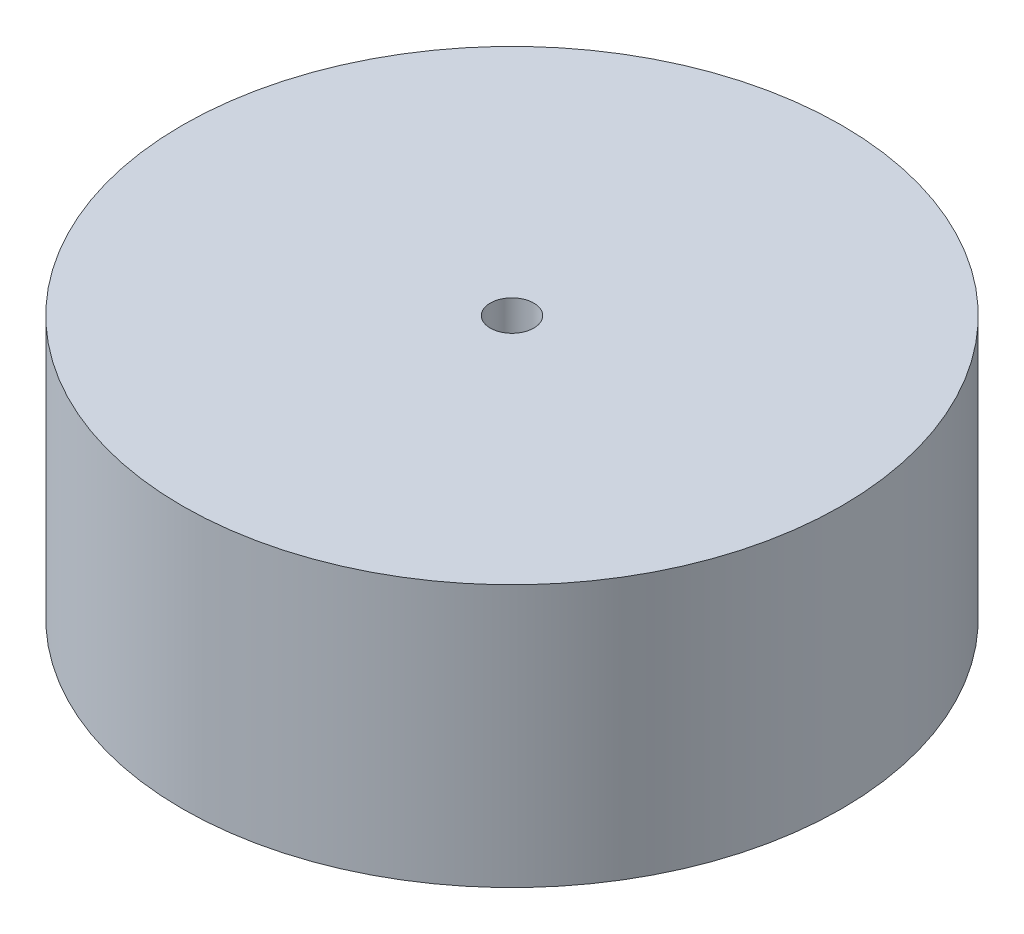
ISO-10303-21;
HEADER;
FILE_DESCRIPTION(('STEP AP214'),'2;1');
FILE_NAME('part.step','',(''),(''),'','','');
FILE_SCHEMA(('AUTOMOTIVE_DESIGN { 1 0 10303 214 1 1 1 1 }'));
ENDSEC;
DATA;
#1=APPLICATION_CONTEXT('core data for automotive mechanical design processes');
#2=APPLICATION_PROTOCOL_DEFINITION('international standard','automotive_design',2000,#1);
#3=PRODUCT_CONTEXT('',#1,'mechanical');
#4=PRODUCT('Part','Part','',(#3));
#5=PRODUCT_RELATED_PRODUCT_CATEGORY('part','',(#4));
#6=PRODUCT_DEFINITION_FORMATION('','',#4);
#7=PRODUCT_DEFINITION_CONTEXT('part definition',#1,'design');
#8=PRODUCT_DEFINITION('design','',#6,#7);
#9=PRODUCT_DEFINITION_SHAPE('','',#8);
#10=(LENGTH_UNIT() NAMED_UNIT(*) SI_UNIT(.MILLI.,.METRE.));
#11=(NAMED_UNIT(*) PLANE_ANGLE_UNIT() SI_UNIT($,.RADIAN.));
#12=(NAMED_UNIT(*) SI_UNIT($,.STERADIAN.) SOLID_ANGLE_UNIT());
#13=UNCERTAINTY_MEASURE_WITH_UNIT(LENGTH_MEASURE(1.E-05),#10,'distance_accuracy_value','');
#14=(GEOMETRIC_REPRESENTATION_CONTEXT(3) GLOBAL_UNCERTAINTY_ASSIGNED_CONTEXT((#13)) GLOBAL_UNIT_ASSIGNED_CONTEXT((#10,
#11,#12)) REPRESENTATION_CONTEXT('',''));
#15=CARTESIAN_POINT('',(0.,0.,0.));
#16=DIRECTION('',(0.,0.,1.));
#17=DIRECTION('',(1.,0.,0.));
#18=AXIS2_PLACEMENT_3D('',#15,#16,#17);
#19=CARTESIAN_POINT('',(0.,17.5,0.));
#20=DIRECTION('',(0.,-1.,0.));
#21=DIRECTION('',(0.,0.,-1.));
#22=AXIS2_PLACEMENT_3D('',#19,#20,#21);
#23=CYLINDRICAL_SURFACE('',#22,22.);
#24=CARTESIAN_POINT('',(0.,17.5,0.));
#25=DIRECTION('',(0.,1.,0.));
#26=DIRECTION('',(0.,0.,1.));
#27=AXIS2_PLACEMENT_3D('',#24,#25,#26);
#28=CIRCLE('',#27,22.);
#29=CARTESIAN_POINT('',(0.,17.5,22.));
#30=VERTEX_POINT('',#29);
#31=EDGE_CURVE('E10',#30,#30,#28,.T.);
#32=ORIENTED_EDGE('',*,*,#31,.F.);
#33=EDGE_LOOP('',(#32));
#34=FACE_BOUND('',#33,.T.);
#35=CARTESIAN_POINT('',(0.,0.,0.));
#36=DIRECTION('',(0.,1.,0.));
#37=DIRECTION('',(0.,0.,1.));
#38=AXIS2_PLACEMENT_3D('',#35,#36,#37);
#39=CIRCLE('',#38,22.);
#40=CARTESIAN_POINT('',(0.,0.,22.));
#41=VERTEX_POINT('',#40);
#42=EDGE_CURVE('E34',#41,#41,#39,.T.);
#43=ORIENTED_EDGE('',*,*,#42,.T.);
#44=EDGE_LOOP('',(#43));
#45=FACE_BOUND('',#44,.T.);
#46=ADVANCED_FACE('F31',(#34,#45),#23,.T.);
#47=CARTESIAN_POINT('',(0.,17.5,0.));
#48=DIRECTION('',(0.,1.,0.));
#49=DIRECTION('',(0.,0.,1.));
#50=AXIS2_PLACEMENT_3D('',#47,#48,#49);
#51=PLANE('',#50);
#52=CARTESIAN_POINT('',(0.,17.5,0.));
#53=DIRECTION('',(0.,1.,0.));
#54=DIRECTION('',(0.,0.,1.));
#55=AXIS2_PLACEMENT_3D('',#52,#53,#54);
#56=CIRCLE('',#55,1.45);
#57=CARTESIAN_POINT('',(0.,17.5,1.45));
#58=VERTEX_POINT('',#57);
#59=EDGE_CURVE('E45',#58,#58,#56,.T.);
#60=ORIENTED_EDGE('',*,*,#59,.F.);
#61=EDGE_LOOP('',(#60));
#62=FACE_BOUND('',#61,.T.);
#63=ORIENTED_EDGE('',*,*,#31,.T.);
#64=EDGE_LOOP('',(#63));
#65=FACE_BOUND('',#64,.T.);
#66=ADVANCED_FACE('F52',(#62,#65),#51,.T.);
#67=CARTESIAN_POINT('',(0.,0.,0.));
#68=DIRECTION('',(0.,1.,0.));
#69=DIRECTION('',(0.,0.,1.));
#70=AXIS2_PLACEMENT_3D('',#67,#68,#69);
#71=PLANE('',#70);
#72=CARTESIAN_POINT('',(0.,0.,0.));
#73=DIRECTION('',(0.,1.,0.));
#74=DIRECTION('',(0.,0.,1.));
#75=AXIS2_PLACEMENT_3D('',#72,#73,#74);
#76=CIRCLE('',#75,1.45);
#77=CARTESIAN_POINT('',(0.,0.,1.45));
#78=VERTEX_POINT('',#77);
#79=EDGE_CURVE('E41',#78,#78,#76,.F.);
#80=ORIENTED_EDGE('',*,*,#79,.F.);
#81=EDGE_LOOP('',(#80));
#82=FACE_BOUND('',#81,.T.);
#83=ORIENTED_EDGE('',*,*,#42,.F.);
#84=EDGE_LOOP('',(#83));
#85=FACE_BOUND('',#84,.T.);
#86=ADVANCED_FACE('F54',(#82,#85),#71,.F.);
#87=CARTESIAN_POINT('',(0.,-0.001000000000001,0.));
#88=DIRECTION('',(0.,1.,0.));
#89=DIRECTION('',(0.,0.,1.));
#90=AXIS2_PLACEMENT_3D('',#87,#88,#89);
#91=CYLINDRICAL_SURFACE('',#90,1.45);
#92=ORIENTED_EDGE('',*,*,#59,.T.);
#93=EDGE_LOOP('',(#92));
#94=FACE_BOUND('',#93,.T.);
#95=ORIENTED_EDGE('',*,*,#79,.T.);
#96=EDGE_LOOP('',(#95));
#97=FACE_BOUND('',#96,.T.);
#98=ADVANCED_FACE('F49',(#94,#97),#91,.F.);
#99=CLOSED_SHELL('',(#46,#66,#86,#98));
#100=MANIFOLD_SOLID_BREP('B2',#99);
#101=ADVANCED_BREP_SHAPE_REPRESENTATION('',(#18,#100),#14);
#102=SHAPE_DEFINITION_REPRESENTATION(#9,#101);
ENDSEC;
END-ISO-10303-21;
